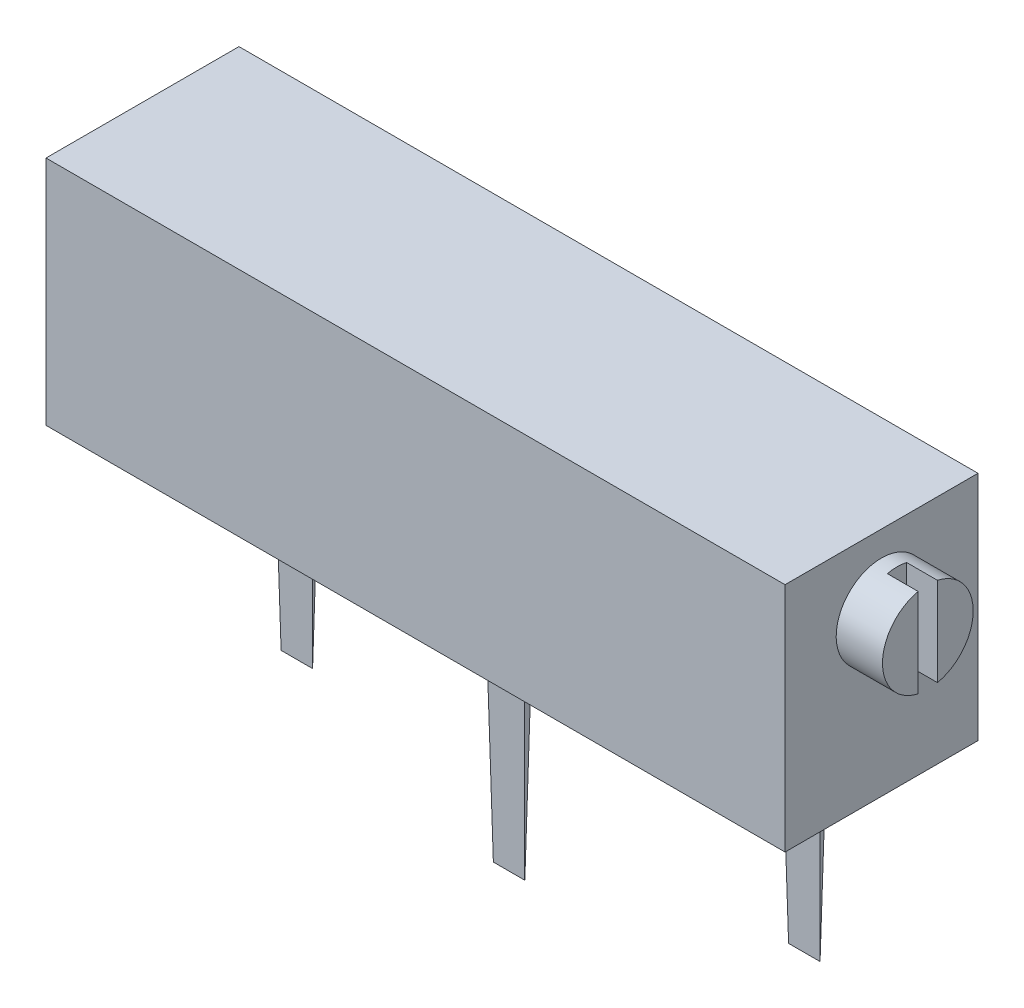
ISO-10303-21;
HEADER;
FILE_DESCRIPTION(('STEP AP214'),'2;1');
FILE_NAME('part.step','',(''),(''),'','','');
FILE_SCHEMA(('AUTOMOTIVE_DESIGN { 1 0 10303 214 1 1 1 1 }'));
ENDSEC;
DATA;
#1=APPLICATION_CONTEXT('core data for automotive mechanical design processes');
#2=APPLICATION_PROTOCOL_DEFINITION('international standard','automotive_design',2000,#1);
#3=PRODUCT_CONTEXT('',#1,'mechanical');
#4=PRODUCT('Part','Part','',(#3));
#5=PRODUCT_RELATED_PRODUCT_CATEGORY('part','',(#4));
#6=PRODUCT_DEFINITION_FORMATION('','',#4);
#7=PRODUCT_DEFINITION_CONTEXT('part definition',#1,'design');
#8=PRODUCT_DEFINITION('design','',#6,#7);
#9=PRODUCT_DEFINITION_SHAPE('','',#8);
#10=(LENGTH_UNIT() NAMED_UNIT(*) SI_UNIT(.MILLI.,.METRE.));
#11=(NAMED_UNIT(*) PLANE_ANGLE_UNIT() SI_UNIT($,.RADIAN.));
#12=(NAMED_UNIT(*) SI_UNIT($,.STERADIAN.) SOLID_ANGLE_UNIT());
#13=UNCERTAINTY_MEASURE_WITH_UNIT(LENGTH_MEASURE(1.E-05),#10,'distance_accuracy_value','');
#14=(GEOMETRIC_REPRESENTATION_CONTEXT(3) GLOBAL_UNCERTAINTY_ASSIGNED_CONTEXT((#13)) GLOBAL_UNIT_ASSIGNED_CONTEXT((#10,
#11,#12)) REPRESENTATION_CONTEXT('',''));
#15=CARTESIAN_POINT('',(0.,0.,0.));
#16=DIRECTION('',(0.,0.,1.));
#17=DIRECTION('',(1.,0.,0.));
#18=AXIS2_PLACEMENT_3D('',#15,#16,#17);
#19=CARTESIAN_POINT('',(15.65,0.,-3.6));
#20=DIRECTION('',(-0.999847695156391,-0.0174524064372835,0.));
#21=DIRECTION('',(0.0174524064372835,-0.999847695156391,0.));
#22=AXIS2_PLACEMENT_3D('',#19,#20,#21);
#23=PLANE('',#22);
#24=DIRECTION('',(0.,0.,-1.));
#25=VECTOR('',#24,1.);
#26=CARTESIAN_POINT('',(15.65,0.,-3.6));
#27=LINE('',#26,#25);
#28=CARTESIAN_POINT('',(15.65,0.,-3.4));
#29=VERTEX_POINT('',#28);
#30=CARTESIAN_POINT('',(15.65,0.,-3.6));
#31=VERTEX_POINT('',#30);
#32=EDGE_CURVE('E98',#29,#31,#27,.T.);
#33=ORIENTED_EDGE('',*,*,#32,.T.);
#34=DIRECTION('',(-0.0174497491606827,0.999695459881887,-0.0174497491606827));
#35=VECTOR('',#34,1.);
#36=CARTESIAN_POINT('',(15.65,0.,-3.6));
#37=LINE('',#36,#35);
#38=CARTESIAN_POINT('',(15.7460028571052,-5.5,-3.5039971428948));
#39=VERTEX_POINT('',#38);
#40=EDGE_CURVE('E12',#39,#31,#37,.T.);
#41=ORIENTED_EDGE('',*,*,#40,.F.);
#42=DIRECTION('',(0.,0.,1.));
#43=VECTOR('',#42,1.);
#44=CARTESIAN_POINT('',(15.7460028571052,-5.5,0.));
#45=LINE('',#44,#43);
#46=CARTESIAN_POINT('',(15.7460028571052,-5.5,-3.4960028571052));
#47=VERTEX_POINT('',#46);
#48=EDGE_CURVE('E114',#47,#39,#45,.F.);
#49=ORIENTED_EDGE('',*,*,#48,.F.);
#50=DIRECTION('',(-0.0174497491606827,0.999695459881887,0.0174497491606827));
#51=VECTOR('',#50,1.);
#52=CARTESIAN_POINT('',(15.6500608987492,-0.00348888700240246,-3.40006089874915));
#53=LINE('',#52,#51);
#54=EDGE_CURVE('E109',#47,#29,#53,.T.);
#55=ORIENTED_EDGE('',*,*,#54,.T.);
#56=EDGE_LOOP('',(#33,#41,#49,#55));
#57=FACE_BOUND('',#56,.T.);
#58=ADVANCED_FACE('F52',(#57),#23,.T.);
#59=CARTESIAN_POINT('',(15.65,0.,-3.6));
#60=DIRECTION('',(0.,-0.0174524064372835,-0.999847695156391));
#61=DIRECTION('',(0.,0.999847695156391,-0.0174524064372835));
#62=AXIS2_PLACEMENT_3D('',#59,#60,#61);
#63=PLANE('',#62);
#64=DIRECTION('',(1.,0.,0.));
#65=VECTOR('',#64,1.);
#66=CARTESIAN_POINT('',(15.65,0.,-3.6));
#67=LINE('',#66,#65);
#68=CARTESIAN_POINT('',(16.65,0.,-3.6));
#69=VERTEX_POINT('',#68);
#70=EDGE_CURVE('E94',#31,#69,#67,.T.);
#71=ORIENTED_EDGE('',*,*,#70,.T.);
#72=DIRECTION('',(0.0174497491606827,0.999695459881887,-0.0174497491606827));
#73=VECTOR('',#72,1.);
#74=CARTESIAN_POINT('',(16.65,0.,-3.6));
#75=LINE('',#74,#73);
#76=CARTESIAN_POINT('',(16.5539971428948,-5.5,-3.5039971428948));
#77=VERTEX_POINT('',#76);
#78=EDGE_CURVE('E61',#77,#69,#75,.T.);
#79=ORIENTED_EDGE('',*,*,#78,.F.);
#80=DIRECTION('',(-1.,0.,0.));
#81=VECTOR('',#80,1.);
#82=CARTESIAN_POINT('',(0.,-5.5,-3.5039971428948));
#83=LINE('',#82,#81);
#84=EDGE_CURVE('E105',#39,#77,#83,.F.);
#85=ORIENTED_EDGE('',*,*,#84,.F.);
#86=ORIENTED_EDGE('',*,*,#40,.T.);
#87=EDGE_LOOP('',(#71,#79,#85,#86));
#88=FACE_BOUND('',#87,.T.);
#89=ADVANCED_FACE('F54',(#88),#63,.T.);
#90=CARTESIAN_POINT('',(16.65,0.,-3.6));
#91=DIRECTION('',(0.999847695156391,-0.0174524064372835,0.));
#92=DIRECTION('',(0.0174524064372835,0.999847695156391,0.));
#93=AXIS2_PLACEMENT_3D('',#90,#91,#92);
#94=PLANE('',#93);
#95=DIRECTION('',(0.,0.,1.));
#96=VECTOR('',#95,1.);
#97=CARTESIAN_POINT('',(16.65,0.,-3.6));
#98=LINE('',#97,#96);
#99=CARTESIAN_POINT('',(16.65,0.,-3.4));
#100=VERTEX_POINT('',#99);
#101=EDGE_CURVE('E99',#69,#100,#98,.T.);
#102=ORIENTED_EDGE('',*,*,#101,.T.);
#103=DIRECTION('',(0.0174497491606827,0.999695459881887,0.0174497491606827));
#104=VECTOR('',#103,1.);
#105=CARTESIAN_POINT('',(16.6496955062542,-0.0174444350120123,-3.40030449374577));
#106=LINE('',#105,#104);
#107=CARTESIAN_POINT('',(16.5539971428948,-5.5,-3.4960028571052));
#108=VERTEX_POINT('',#107);
#109=EDGE_CURVE('E117',#108,#100,#106,.T.);
#110=ORIENTED_EDGE('',*,*,#109,.F.);
#111=DIRECTION('',(0.,0.,-1.));
#112=VECTOR('',#111,1.);
#113=CARTESIAN_POINT('',(16.5539971428948,-5.5,0.));
#114=LINE('',#113,#112);
#115=EDGE_CURVE('E73',#77,#108,#114,.F.);
#116=ORIENTED_EDGE('',*,*,#115,.F.);
#117=ORIENTED_EDGE('',*,*,#78,.T.);
#118=EDGE_LOOP('',(#102,#110,#116,#117));
#119=FACE_BOUND('',#118,.T.);
#120=ADVANCED_FACE('F124',(#119),#94,.T.);
#121=CARTESIAN_POINT('',(15.65,0.,-3.4));
#122=DIRECTION('',(0.,-0.0174524064372835,0.999847695156391));
#123=DIRECTION('',(0.,-0.999847695156391,-0.0174524064372835));
#124=AXIS2_PLACEMENT_3D('',#121,#122,#123);
#125=PLANE('',#124);
#126=DIRECTION('',(-1.,0.,0.));
#127=VECTOR('',#126,1.);
#128=CARTESIAN_POINT('',(15.65,0.,-3.4));
#129=LINE('',#128,#127);
#130=EDGE_CURVE('E113',#100,#29,#129,.T.);
#131=ORIENTED_EDGE('',*,*,#130,.T.);
#132=ORIENTED_EDGE('',*,*,#54,.F.);
#133=DIRECTION('',(1.,0.,0.));
#134=VECTOR('',#133,1.);
#135=CARTESIAN_POINT('',(0.,-5.5,-3.4960028571052));
#136=LINE('',#135,#134);
#137=EDGE_CURVE('E56',#108,#47,#136,.F.);
#138=ORIENTED_EDGE('',*,*,#137,.F.);
#139=ORIENTED_EDGE('',*,*,#109,.T.);
#140=EDGE_LOOP('',(#131,#132,#138,#139));
#141=FACE_BOUND('',#140,.T.);
#142=ADVANCED_FACE('F126',(#141),#125,.T.);
#143=CARTESIAN_POINT('',(0.,-5.5,0.));
#144=DIRECTION('',(0.,1.,0.));
#145=DIRECTION('',(0.,0.,1.));
#146=AXIS2_PLACEMENT_3D('',#143,#144,#145);
#147=PLANE('',#146);
#148=ORIENTED_EDGE('',*,*,#48,.T.);
#149=ORIENTED_EDGE('',*,*,#84,.T.);
#150=ORIENTED_EDGE('',*,*,#115,.T.);
#151=ORIENTED_EDGE('',*,*,#137,.T.);
#152=EDGE_LOOP('',(#148,#149,#150,#151));
#153=FACE_BOUND('',#152,.T.);
#154=ADVANCED_FACE('F122',(#153),#147,.F.);
#155=CARTESIAN_POINT('',(0.,0.,0.));
#156=DIRECTION('',(0.,1.,0.));
#157=DIRECTION('',(0.,0.,1.));
#158=AXIS2_PLACEMENT_3D('',#155,#156,#157);
#159=PLANE('',#158);
#160=ORIENTED_EDGE('',*,*,#32,.F.);
#161=ORIENTED_EDGE('',*,*,#130,.F.);
#162=ORIENTED_EDGE('',*,*,#101,.F.);
#163=ORIENTED_EDGE('',*,*,#70,.F.);
#164=EDGE_LOOP('',(#160,#161,#162,#163));
#165=FACE_BOUND('',#164,.T.);
#166=ADVANCED_FACE('F95',(#165),#159,.T.);
#167=CLOSED_SHELL('',(#58,#89,#120,#142,#154,#166));
#168=MANIFOLD_SOLID_BREP('B2',#167);
#169=CARTESIAN_POINT('',(10.,0.,-1.6));
#170=DIRECTION('',(-0.999847695156391,-0.0174524064372835,0.));
#171=DIRECTION('',(0.0174524064372835,-0.999847695156391,0.));
#172=AXIS2_PLACEMENT_3D('',#169,#170,#171);
#173=PLANE('',#172);
#174=DIRECTION('',(0.,0.,-1.));
#175=VECTOR('',#174,1.);
#176=CARTESIAN_POINT('',(10.,0.,-1.6));
#177=LINE('',#176,#175);
#178=CARTESIAN_POINT('',(10.,0.,-1.4));
#179=VERTEX_POINT('',#178);
#180=CARTESIAN_POINT('',(10.,0.,-1.6));
#181=VERTEX_POINT('',#180);
#182=EDGE_CURVE('E232',#179,#181,#177,.T.);
#183=ORIENTED_EDGE('',*,*,#182,.T.);
#184=DIRECTION('',(-0.0174497491606827,0.999695459881887,-0.0174497491606827));
#185=VECTOR('',#184,1.);
#186=CARTESIAN_POINT('',(10.,0.,-1.6));
#187=LINE('',#186,#185);
#188=CARTESIAN_POINT('',(10.0960028571052,-5.5,-1.5039971428948));
#189=VERTEX_POINT('',#188);
#190=EDGE_CURVE('E50',#189,#181,#187,.T.);
#191=ORIENTED_EDGE('',*,*,#190,.F.);
#192=DIRECTION('',(0.,0.,1.));
#193=VECTOR('',#192,1.);
#194=CARTESIAN_POINT('',(10.0960028571052,-5.5,0.));
#195=LINE('',#194,#193);
#196=CARTESIAN_POINT('',(10.0960028571052,-5.5,-1.4960028571052));
#197=VERTEX_POINT('',#196);
#198=EDGE_CURVE('E248',#197,#189,#195,.F.);
#199=ORIENTED_EDGE('',*,*,#198,.F.);
#200=DIRECTION('',(-0.0174497491606827,0.999695459881887,0.0174497491606827));
#201=VECTOR('',#200,1.);
#202=CARTESIAN_POINT('',(10.0000608987492,-0.00348888700240246,-1.40006089874915));
#203=LINE('',#202,#201);
#204=EDGE_CURVE('E243',#197,#179,#203,.T.);
#205=ORIENTED_EDGE('',*,*,#204,.T.);
#206=EDGE_LOOP('',(#183,#191,#199,#205));
#207=FACE_BOUND('',#206,.T.);
#208=ADVANCED_FACE('F186',(#207),#173,.T.);
#209=CARTESIAN_POINT('',(10.,0.,-1.6));
#210=DIRECTION('',(0.,-0.0174524064372835,-0.999847695156391));
#211=DIRECTION('',(0.,0.999847695156391,-0.0174524064372835));
#212=AXIS2_PLACEMENT_3D('',#209,#210,#211);
#213=PLANE('',#212);
#214=DIRECTION('',(1.,0.,0.));
#215=VECTOR('',#214,1.);
#216=CARTESIAN_POINT('',(10.,0.,-1.6));
#217=LINE('',#216,#215);
#218=CARTESIAN_POINT('',(11.,0.,-1.6));
#219=VERTEX_POINT('',#218);
#220=EDGE_CURVE('E228',#181,#219,#217,.T.);
#221=ORIENTED_EDGE('',*,*,#220,.T.);
#222=DIRECTION('',(0.0174497491606827,0.999695459881887,-0.0174497491606827));
#223=VECTOR('',#222,1.);
#224=CARTESIAN_POINT('',(11.,0.,-1.6));
#225=LINE('',#224,#223);
#226=CARTESIAN_POINT('',(10.9039971428948,-5.5,-1.5039971428948));
#227=VERTEX_POINT('',#226);
#228=EDGE_CURVE('E195',#227,#219,#225,.T.);
#229=ORIENTED_EDGE('',*,*,#228,.F.);
#230=DIRECTION('',(-1.,0.,0.));
#231=VECTOR('',#230,1.);
#232=CARTESIAN_POINT('',(0.,-5.5,-1.5039971428948));
#233=LINE('',#232,#231);
#234=EDGE_CURVE('E239',#189,#227,#233,.F.);
#235=ORIENTED_EDGE('',*,*,#234,.F.);
#236=ORIENTED_EDGE('',*,*,#190,.T.);
#237=EDGE_LOOP('',(#221,#229,#235,#236));
#238=FACE_BOUND('',#237,.T.);
#239=ADVANCED_FACE('F188',(#238),#213,.T.);
#240=CARTESIAN_POINT('',(11.,0.,-1.6));
#241=DIRECTION('',(0.999847695156391,-0.0174524064372835,0.));
#242=DIRECTION('',(0.0174524064372835,0.999847695156391,0.));
#243=AXIS2_PLACEMENT_3D('',#240,#241,#242);
#244=PLANE('',#243);
#245=DIRECTION('',(0.,0.,1.));
#246=VECTOR('',#245,1.);
#247=CARTESIAN_POINT('',(11.,0.,-1.6));
#248=LINE('',#247,#246);
#249=CARTESIAN_POINT('',(11.,0.,-1.4));
#250=VERTEX_POINT('',#249);
#251=EDGE_CURVE('E233',#219,#250,#248,.T.);
#252=ORIENTED_EDGE('',*,*,#251,.T.);
#253=DIRECTION('',(0.0174497491606827,0.999695459881887,0.0174497491606827));
#254=VECTOR('',#253,1.);
#255=CARTESIAN_POINT('',(10.9996955062542,-0.0174444350120123,-1.40030449374577));
#256=LINE('',#255,#254);
#257=CARTESIAN_POINT('',(10.9039971428948,-5.5,-1.4960028571052));
#258=VERTEX_POINT('',#257);
#259=EDGE_CURVE('E251',#258,#250,#256,.T.);
#260=ORIENTED_EDGE('',*,*,#259,.F.);
#261=DIRECTION('',(0.,0.,-1.));
#262=VECTOR('',#261,1.);
#263=CARTESIAN_POINT('',(10.9039971428948,-5.5,0.));
#264=LINE('',#263,#262);
#265=EDGE_CURVE('E207',#227,#258,#264,.F.);
#266=ORIENTED_EDGE('',*,*,#265,.F.);
#267=ORIENTED_EDGE('',*,*,#228,.T.);
#268=EDGE_LOOP('',(#252,#260,#266,#267));
#269=FACE_BOUND('',#268,.T.);
#270=ADVANCED_FACE('F258',(#269),#244,.T.);
#271=CARTESIAN_POINT('',(10.,0.,-1.4));
#272=DIRECTION('',(0.,-0.0174524064372835,0.999847695156391));
#273=DIRECTION('',(0.,-0.999847695156391,-0.0174524064372835));
#274=AXIS2_PLACEMENT_3D('',#271,#272,#273);
#275=PLANE('',#274);
#276=DIRECTION('',(-1.,0.,0.));
#277=VECTOR('',#276,1.);
#278=CARTESIAN_POINT('',(10.,0.,-1.4));
#279=LINE('',#278,#277);
#280=EDGE_CURVE('E247',#250,#179,#279,.T.);
#281=ORIENTED_EDGE('',*,*,#280,.T.);
#282=ORIENTED_EDGE('',*,*,#204,.F.);
#283=DIRECTION('',(1.,0.,0.));
#284=VECTOR('',#283,1.);
#285=CARTESIAN_POINT('',(0.,-5.5,-1.4960028571052));
#286=LINE('',#285,#284);
#287=EDGE_CURVE('E190',#258,#197,#286,.F.);
#288=ORIENTED_EDGE('',*,*,#287,.F.);
#289=ORIENTED_EDGE('',*,*,#259,.T.);
#290=EDGE_LOOP('',(#281,#282,#288,#289));
#291=FACE_BOUND('',#290,.T.);
#292=ADVANCED_FACE('F260',(#291),#275,.T.);
#293=CARTESIAN_POINT('',(0.,-5.5,0.));
#294=DIRECTION('',(0.,1.,0.));
#295=DIRECTION('',(0.,0.,1.));
#296=AXIS2_PLACEMENT_3D('',#293,#294,#295);
#297=PLANE('',#296);
#298=ORIENTED_EDGE('',*,*,#198,.T.);
#299=ORIENTED_EDGE('',*,*,#234,.T.);
#300=ORIENTED_EDGE('',*,*,#265,.T.);
#301=ORIENTED_EDGE('',*,*,#287,.T.);
#302=EDGE_LOOP('',(#298,#299,#300,#301));
#303=FACE_BOUND('',#302,.T.);
#304=ADVANCED_FACE('F256',(#303),#297,.F.);
#305=CARTESIAN_POINT('',(0.,0.,0.));
#306=DIRECTION('',(0.,1.,0.));
#307=DIRECTION('',(0.,0.,1.));
#308=AXIS2_PLACEMENT_3D('',#305,#306,#307);
#309=PLANE('',#308);
#310=ORIENTED_EDGE('',*,*,#182,.F.);
#311=ORIENTED_EDGE('',*,*,#280,.F.);
#312=ORIENTED_EDGE('',*,*,#251,.F.);
#313=ORIENTED_EDGE('',*,*,#220,.F.);
#314=EDGE_LOOP('',(#310,#311,#312,#313));
#315=FACE_BOUND('',#314,.T.);
#316=ADVANCED_FACE('F229',(#315),#309,.T.);
#317=CLOSED_SHELL('',(#208,#239,#270,#292,#304,#316));
#318=MANIFOLD_SOLID_BREP('B6',#317);
#319=CARTESIAN_POINT('',(2.5,0.,-3.6));
#320=DIRECTION('',(-0.999847695156391,-0.0174524064372835,0.));
#321=DIRECTION('',(0.0174524064372835,-0.999847695156391,0.));
#322=AXIS2_PLACEMENT_3D('',#319,#320,#321);
#323=PLANE('',#322);
#324=DIRECTION('',(0.,0.,-1.));
#325=VECTOR('',#324,1.);
#326=CARTESIAN_POINT('',(2.5,0.,-3.6));
#327=LINE('',#326,#325);
#328=CARTESIAN_POINT('',(2.5,0.,-3.4));
#329=VERTEX_POINT('',#328);
#330=CARTESIAN_POINT('',(2.5,0.,-3.6));
#331=VERTEX_POINT('',#330);
#332=EDGE_CURVE('E366',#329,#331,#327,.T.);
#333=ORIENTED_EDGE('',*,*,#332,.T.);
#334=DIRECTION('',(-0.0174497491606827,0.999695459881887,-0.0174497491606827));
#335=VECTOR('',#334,1.);
#336=CARTESIAN_POINT('',(2.5,0.,-3.6));
#337=LINE('',#336,#335);
#338=CARTESIAN_POINT('',(2.5960028571052,-5.5,-3.5039971428948));
#339=VERTEX_POINT('',#338);
#340=EDGE_CURVE('E184',#339,#331,#337,.T.);
#341=ORIENTED_EDGE('',*,*,#340,.F.);
#342=DIRECTION('',(0.,0.,1.));
#343=VECTOR('',#342,1.);
#344=CARTESIAN_POINT('',(2.5960028571052,-5.5,0.));
#345=LINE('',#344,#343);
#346=CARTESIAN_POINT('',(2.5960028571052,-5.5,-3.4960028571052));
#347=VERTEX_POINT('',#346);
#348=EDGE_CURVE('E382',#347,#339,#345,.F.);
#349=ORIENTED_EDGE('',*,*,#348,.F.);
#350=DIRECTION('',(-0.0174497491606827,0.999695459881887,0.0174497491606827));
#351=VECTOR('',#350,1.);
#352=CARTESIAN_POINT('',(2.50006089874915,-0.00348888700240246,-3.40006089874915));
#353=LINE('',#352,#351);
#354=EDGE_CURVE('E377',#347,#329,#353,.T.);
#355=ORIENTED_EDGE('',*,*,#354,.T.);
#356=EDGE_LOOP('',(#333,#341,#349,#355));
#357=FACE_BOUND('',#356,.T.);
#358=ADVANCED_FACE('F320',(#357),#323,.T.);
#359=CARTESIAN_POINT('',(2.5,0.,-3.6));
#360=DIRECTION('',(0.,-0.0174524064372835,-0.999847695156391));
#361=DIRECTION('',(0.,0.999847695156391,-0.0174524064372835));
#362=AXIS2_PLACEMENT_3D('',#359,#360,#361);
#363=PLANE('',#362);
#364=DIRECTION('',(1.,0.,0.));
#365=VECTOR('',#364,1.);
#366=CARTESIAN_POINT('',(2.5,0.,-3.6));
#367=LINE('',#366,#365);
#368=CARTESIAN_POINT('',(3.5,0.,-3.6));
#369=VERTEX_POINT('',#368);
#370=EDGE_CURVE('E362',#331,#369,#367,.T.);
#371=ORIENTED_EDGE('',*,*,#370,.T.);
#372=DIRECTION('',(0.0174497491606827,0.999695459881887,-0.0174497491606827));
#373=VECTOR('',#372,1.);
#374=CARTESIAN_POINT('',(3.5,0.,-3.6));
#375=LINE('',#374,#373);
#376=CARTESIAN_POINT('',(3.4039971428948,-5.5,-3.5039971428948));
#377=VERTEX_POINT('',#376);
#378=EDGE_CURVE('E329',#377,#369,#375,.T.);
#379=ORIENTED_EDGE('',*,*,#378,.F.);
#380=DIRECTION('',(-1.,0.,0.));
#381=VECTOR('',#380,1.);
#382=CARTESIAN_POINT('',(0.,-5.5,-3.5039971428948));
#383=LINE('',#382,#381);
#384=EDGE_CURVE('E373',#339,#377,#383,.F.);
#385=ORIENTED_EDGE('',*,*,#384,.F.);
#386=ORIENTED_EDGE('',*,*,#340,.T.);
#387=EDGE_LOOP('',(#371,#379,#385,#386));
#388=FACE_BOUND('',#387,.T.);
#389=ADVANCED_FACE('F322',(#388),#363,.T.);
#390=CARTESIAN_POINT('',(3.5,0.,-3.6));
#391=DIRECTION('',(0.999847695156391,-0.0174524064372835,0.));
#392=DIRECTION('',(0.0174524064372835,0.999847695156391,0.));
#393=AXIS2_PLACEMENT_3D('',#390,#391,#392);
#394=PLANE('',#393);
#395=DIRECTION('',(0.,0.,1.));
#396=VECTOR('',#395,1.);
#397=CARTESIAN_POINT('',(3.5,0.,-3.6));
#398=LINE('',#397,#396);
#399=CARTESIAN_POINT('',(3.5,0.,-3.4));
#400=VERTEX_POINT('',#399);
#401=EDGE_CURVE('E367',#369,#400,#398,.T.);
#402=ORIENTED_EDGE('',*,*,#401,.T.);
#403=DIRECTION('',(0.0174497491606827,0.999695459881887,0.0174497491606827));
#404=VECTOR('',#403,1.);
#405=CARTESIAN_POINT('',(3.49969550625423,-0.0174444350120123,-3.40030449374577));
#406=LINE('',#405,#404);
#407=CARTESIAN_POINT('',(3.4039971428948,-5.5,-3.4960028571052));
#408=VERTEX_POINT('',#407);
#409=EDGE_CURVE('E385',#408,#400,#406,.T.);
#410=ORIENTED_EDGE('',*,*,#409,.F.);
#411=DIRECTION('',(0.,0.,-1.));
#412=VECTOR('',#411,1.);
#413=CARTESIAN_POINT('',(3.4039971428948,-5.5,0.));
#414=LINE('',#413,#412);
#415=EDGE_CURVE('E341',#377,#408,#414,.F.);
#416=ORIENTED_EDGE('',*,*,#415,.F.);
#417=ORIENTED_EDGE('',*,*,#378,.T.);
#418=EDGE_LOOP('',(#402,#410,#416,#417));
#419=FACE_BOUND('',#418,.T.);
#420=ADVANCED_FACE('F392',(#419),#394,.T.);
#421=CARTESIAN_POINT('',(2.5,0.,-3.4));
#422=DIRECTION('',(0.,-0.0174524064372835,0.999847695156391));
#423=DIRECTION('',(0.,-0.999847695156391,-0.0174524064372835));
#424=AXIS2_PLACEMENT_3D('',#421,#422,#423);
#425=PLANE('',#424);
#426=DIRECTION('',(-1.,0.,0.));
#427=VECTOR('',#426,1.);
#428=CARTESIAN_POINT('',(2.5,0.,-3.4));
#429=LINE('',#428,#427);
#430=EDGE_CURVE('E381',#400,#329,#429,.T.);
#431=ORIENTED_EDGE('',*,*,#430,.T.);
#432=ORIENTED_EDGE('',*,*,#354,.F.);
#433=DIRECTION('',(1.,0.,0.));
#434=VECTOR('',#433,1.);
#435=CARTESIAN_POINT('',(0.,-5.5,-3.4960028571052));
#436=LINE('',#435,#434);
#437=EDGE_CURVE('E324',#408,#347,#436,.F.);
#438=ORIENTED_EDGE('',*,*,#437,.F.);
#439=ORIENTED_EDGE('',*,*,#409,.T.);
#440=EDGE_LOOP('',(#431,#432,#438,#439));
#441=FACE_BOUND('',#440,.T.);
#442=ADVANCED_FACE('F394',(#441),#425,.T.);
#443=CARTESIAN_POINT('',(0.,-5.5,0.));
#444=DIRECTION('',(0.,1.,0.));
#445=DIRECTION('',(0.,0.,1.));
#446=AXIS2_PLACEMENT_3D('',#443,#444,#445);
#447=PLANE('',#446);
#448=ORIENTED_EDGE('',*,*,#348,.T.);
#449=ORIENTED_EDGE('',*,*,#384,.T.);
#450=ORIENTED_EDGE('',*,*,#415,.T.);
#451=ORIENTED_EDGE('',*,*,#437,.T.);
#452=EDGE_LOOP('',(#448,#449,#450,#451));
#453=FACE_BOUND('',#452,.T.);
#454=ADVANCED_FACE('F390',(#453),#447,.F.);
#455=CARTESIAN_POINT('',(0.,0.,0.));
#456=DIRECTION('',(0.,1.,0.));
#457=DIRECTION('',(0.,0.,1.));
#458=AXIS2_PLACEMENT_3D('',#455,#456,#457);
#459=PLANE('',#458);
#460=ORIENTED_EDGE('',*,*,#332,.F.);
#461=ORIENTED_EDGE('',*,*,#430,.F.);
#462=ORIENTED_EDGE('',*,*,#401,.F.);
#463=ORIENTED_EDGE('',*,*,#370,.F.);
#464=EDGE_LOOP('',(#460,#461,#462,#463));
#465=FACE_BOUND('',#464,.T.);
#466=ADVANCED_FACE('F363',(#465),#459,.T.);
#467=CLOSED_SHELL('',(#358,#389,#420,#442,#454,#466));
#468=MANIFOLD_SOLID_BREP('B44',#467);
#469=CARTESIAN_POINT('',(20.35,4.175,-2.5));
#470=DIRECTION('',(1.,0.,0.));
#471=DIRECTION('',(0.,0.,-1.));
#472=AXIS2_PLACEMENT_3D('',#469,#470,#471);
#473=PLANE('',#472);
#474=DIRECTION('',(0.,-1.,0.));
#475=VECTOR('',#474,1.);
#476=CARTESIAN_POINT('',(20.35,4.175,-2.25));
#477=LINE('',#476,#475);
#478=CARTESIAN_POINT('',(20.35,5.3230962503205,-2.25));
#479=VERTEX_POINT('',#478);
#480=CARTESIAN_POINT('',(20.35,3.0269037496795,-2.25));
#481=VERTEX_POINT('',#480);
#482=EDGE_CURVE('E499',#479,#481,#477,.T.);
#483=ORIENTED_EDGE('',*,*,#482,.F.);
#484=CARTESIAN_POINT('',(20.35,4.175,-2.5));
#485=DIRECTION('',(1.,0.,0.));
#486=DIRECTION('',(0.,0.,-1.));
#487=AXIS2_PLACEMENT_3D('',#484,#485,#486);
#488=CIRCLE('',#487,1.175);
#489=EDGE_CURVE('E500',#479,#481,#488,.T.);
#490=ORIENTED_EDGE('',*,*,#489,.T.);
#491=EDGE_LOOP('',(#483,#490));
#492=FACE_BOUND('',#491,.T.);
#493=ADVANCED_FACE('F453',(#492),#473,.T.);
#494=CARTESIAN_POINT('',(20.35,4.175,-2.5));
#495=DIRECTION('',(-1.,0.,0.));
#496=DIRECTION('',(0.,0.,1.));
#497=AXIS2_PLACEMENT_3D('',#494,#495,#496);
#498=CYLINDRICAL_SURFACE('',#497,1.175);
#499=ORIENTED_EDGE('',*,*,#489,.F.);
#500=DIRECTION('',(-1.,0.,0.));
#501=VECTOR('',#500,1.);
#502=CARTESIAN_POINT('',(20.35,5.3230962503205,-2.25));
#503=LINE('',#502,#501);
#504=CARTESIAN_POINT('',(19.55,5.3230962503205,-2.25));
#505=VERTEX_POINT('',#504);
#506=EDGE_CURVE('E513',#479,#505,#503,.T.);
#507=ORIENTED_EDGE('',*,*,#506,.T.);
#508=CARTESIAN_POINT('',(19.55,4.175,-2.5));
#509=DIRECTION('',(1.,0.,0.));
#510=DIRECTION('',(0.,0.,-1.));
#511=AXIS2_PLACEMENT_3D('',#508,#509,#510);
#512=CIRCLE('',#511,1.175);
#513=CARTESIAN_POINT('',(19.55,5.3230962503205,-2.75));
#514=VERTEX_POINT('',#513);
#515=EDGE_CURVE('E318',#514,#505,#512,.T.);
#516=ORIENTED_EDGE('',*,*,#515,.F.);
#517=DIRECTION('',(-1.,0.,0.));
#518=VECTOR('',#517,1.);
#519=CARTESIAN_POINT('',(20.35,5.3230962503205,-2.75));
#520=LINE('',#519,#518);
#521=CARTESIAN_POINT('',(20.35,5.3230962503205,-2.75));
#522=VERTEX_POINT('',#521);
#523=EDGE_CURVE('E494',#514,#522,#520,.F.);
#524=ORIENTED_EDGE('',*,*,#523,.T.);
#525=CARTESIAN_POINT('',(20.35,3.0269037496795,-2.75));
#526=VERTEX_POINT('',#525);
#527=EDGE_CURVE('E504',#526,#522,#488,.T.);
#528=ORIENTED_EDGE('',*,*,#527,.F.);
#529=DIRECTION('',(-1.,0.,0.));
#530=VECTOR('',#529,1.);
#531=CARTESIAN_POINT('',(20.35,3.0269037496795,-2.75));
#532=LINE('',#531,#530);
#533=CARTESIAN_POINT('',(19.55,3.0269037496795,-2.75));
#534=VERTEX_POINT('',#533);
#535=EDGE_CURVE('E468',#526,#534,#532,.T.);
#536=ORIENTED_EDGE('',*,*,#535,.T.);
#537=CARTESIAN_POINT('',(19.55,3.0269037496795,-2.25));
#538=VERTEX_POINT('',#537);
#539=EDGE_CURVE('E457',#538,#534,#512,.T.);
#540=ORIENTED_EDGE('',*,*,#539,.F.);
#541=DIRECTION('',(-1.,0.,0.));
#542=VECTOR('',#541,1.);
#543=CARTESIAN_POINT('',(20.35,3.0269037496795,-2.25));
#544=LINE('',#543,#542);
#545=EDGE_CURVE('E525',#538,#481,#544,.F.);
#546=ORIENTED_EDGE('',*,*,#545,.T.);
#547=EDGE_LOOP('',(#499,#507,#516,#524,#528,#536,#540,#546));
#548=FACE_BOUND('',#547,.T.);
#549=CARTESIAN_POINT('',(19.15,4.175,-2.5));
#550=DIRECTION('',(1.,0.,0.));
#551=DIRECTION('',(0.,0.,-1.));
#552=AXIS2_PLACEMENT_3D('',#549,#550,#551);
#553=CIRCLE('',#552,1.175);
#554=CARTESIAN_POINT('',(19.15,4.175,-3.675));
#555=VERTEX_POINT('',#554);
#556=EDGE_CURVE('E509',#555,#555,#553,.T.);
#557=ORIENTED_EDGE('',*,*,#556,.T.);
#558=EDGE_LOOP('',(#557));
#559=FACE_BOUND('',#558,.T.);
#560=ADVANCED_FACE('F455',(#548,#559),#498,.T.);
#561=DIRECTION('',(0.,1.,0.));
#562=VECTOR('',#561,1.);
#563=CARTESIAN_POINT('',(20.35,4.175,-2.75));
#564=LINE('',#563,#562);
#565=EDGE_CURVE('E491',#526,#522,#564,.T.);
#566=ORIENTED_EDGE('',*,*,#565,.F.);
#567=ORIENTED_EDGE('',*,*,#527,.T.);
#568=EDGE_LOOP('',(#566,#567));
#569=FACE_BOUND('',#568,.T.);
#570=ADVANCED_FACE('F508',(#569),#473,.T.);
#571=CARTESIAN_POINT('',(19.15,4.175,-2.5));
#572=DIRECTION('',(1.,0.,0.));
#573=DIRECTION('',(0.,0.,-1.));
#574=AXIS2_PLACEMENT_3D('',#571,#572,#573);
#575=PLANE('',#574);
#576=ORIENTED_EDGE('',*,*,#556,.F.);
#577=EDGE_LOOP('',(#576));
#578=FACE_BOUND('',#577,.T.);
#579=ADVANCED_FACE('F537',(#578),#575,.F.);
#580=CARTESIAN_POINT('',(19.55,0.,0.));
#581=DIRECTION('',(1.,0.,0.));
#582=DIRECTION('',(0.,0.,-1.));
#583=AXIS2_PLACEMENT_3D('',#580,#581,#582);
#584=PLANE('',#583);
#585=DIRECTION('',(0.,1.,0.));
#586=VECTOR('',#585,1.);
#587=CARTESIAN_POINT('',(19.55,5.35,-2.75));
#588=LINE('',#587,#586);
#589=EDGE_CURVE('E506',#534,#514,#588,.T.);
#590=ORIENTED_EDGE('',*,*,#589,.T.);
#591=ORIENTED_EDGE('',*,*,#515,.T.);
#592=DIRECTION('',(0.,-1.,0.));
#593=VECTOR('',#592,1.);
#594=CARTESIAN_POINT('',(19.55,5.35,-2.25));
#595=LINE('',#594,#593);
#596=EDGE_CURVE('E523',#505,#538,#595,.T.);
#597=ORIENTED_EDGE('',*,*,#596,.T.);
#598=ORIENTED_EDGE('',*,*,#539,.T.);
#599=EDGE_LOOP('',(#590,#591,#597,#598));
#600=FACE_BOUND('',#599,.T.);
#601=ADVANCED_FACE('F521',(#600),#584,.T.);
#602=CARTESIAN_POINT('',(19.55,5.35,-2.25));
#603=DIRECTION('',(0.,0.,1.));
#604=DIRECTION('',(0.,-1.,0.));
#605=AXIS2_PLACEMENT_3D('',#602,#603,#604);
#606=PLANE('',#605);
#607=ORIENTED_EDGE('',*,*,#482,.T.);
#608=ORIENTED_EDGE('',*,*,#545,.F.);
#609=ORIENTED_EDGE('',*,*,#596,.F.);
#610=ORIENTED_EDGE('',*,*,#506,.F.);
#611=EDGE_LOOP('',(#607,#608,#609,#610));
#612=FACE_BOUND('',#611,.T.);
#613=ADVANCED_FACE('F528',(#612),#606,.F.);
#614=CARTESIAN_POINT('',(19.55,5.35,-2.75));
#615=DIRECTION('',(0.,0.,-1.));
#616=DIRECTION('',(0.,1.,0.));
#617=AXIS2_PLACEMENT_3D('',#614,#615,#616);
#618=PLANE('',#617);
#619=ORIENTED_EDGE('',*,*,#565,.T.);
#620=ORIENTED_EDGE('',*,*,#523,.F.);
#621=ORIENTED_EDGE('',*,*,#589,.F.);
#622=ORIENTED_EDGE('',*,*,#535,.F.);
#623=EDGE_LOOP('',(#619,#620,#621,#622));
#624=FACE_BOUND('',#623,.T.);
#625=ADVANCED_FACE('F493',(#624),#618,.F.);
#626=CLOSED_SHELL('',(#493,#560,#570,#579,#601,#613,#625));
#627=MANIFOLD_SOLID_BREP('B178',#626);
#628=CARTESIAN_POINT('',(0.,6.,0.));
#629=DIRECTION('',(1.,0.,0.));
#630=DIRECTION('',(0.,0.,-1.));
#631=AXIS2_PLACEMENT_3D('',#628,#629,#630);
#632=PLANE('',#631);
#633=DIRECTION('',(0.,0.,1.));
#634=VECTOR('',#633,1.);
#635=CARTESIAN_POINT('',(0.,0.,0.));
#636=LINE('',#635,#634);
#637=CARTESIAN_POINT('',(0.,0.,-5.));
#638=VERTEX_POINT('',#637);
#639=CARTESIAN_POINT('',(0.,0.,0.));
#640=VERTEX_POINT('',#639);
#641=EDGE_CURVE('E657',#638,#640,#636,.T.);
#642=ORIENTED_EDGE('',*,*,#641,.T.);
#643=DIRECTION('',(0.,-1.,0.));
#644=VECTOR('',#643,1.);
#645=CARTESIAN_POINT('',(0.,6.,0.));
#646=LINE('',#645,#644);
#647=CARTESIAN_POINT('',(0.,6.,0.));
#648=VERTEX_POINT('',#647);
#649=EDGE_CURVE('E451',#648,#640,#646,.T.);
#650=ORIENTED_EDGE('',*,*,#649,.F.);
#651=DIRECTION('',(0.,0.,1.));
#652=VECTOR('',#651,1.);
#653=CARTESIAN_POINT('',(0.,6.,0.));
#654=LINE('',#653,#652);
#655=CARTESIAN_POINT('',(0.,6.,-5.));
#656=VERTEX_POINT('',#655);
#657=EDGE_CURVE('E641',#656,#648,#654,.T.);
#658=ORIENTED_EDGE('',*,*,#657,.F.);
#659=DIRECTION('',(0.,-1.,0.));
#660=VECTOR('',#659,1.);
#661=CARTESIAN_POINT('',(0.,6.,-5.));
#662=LINE('',#661,#660);
#663=EDGE_CURVE('E653',#656,#638,#662,.T.);
#664=ORIENTED_EDGE('',*,*,#663,.T.);
#665=EDGE_LOOP('',(#642,#650,#658,#664));
#666=FACE_BOUND('',#665,.T.);
#667=ADVANCED_FACE('F589',(#666),#632,.F.);
#668=CARTESIAN_POINT('',(0.,6.,0.));
#669=DIRECTION('',(0.,0.,-1.));
#670=DIRECTION('',(-1.,0.,0.));
#671=AXIS2_PLACEMENT_3D('',#668,#669,#670);
#672=PLANE('',#671);
#673=DIRECTION('',(1.,0.,0.));
#674=VECTOR('',#673,1.);
#675=CARTESIAN_POINT('',(0.,0.,0.));
#676=LINE('',#675,#674);
#677=CARTESIAN_POINT('',(19.15,0.,0.));
#678=VERTEX_POINT('',#677);
#679=EDGE_CURVE('E646',#640,#678,#676,.T.);
#680=ORIENTED_EDGE('',*,*,#679,.T.);
#681=DIRECTION('',(0.,-1.,0.));
#682=VECTOR('',#681,1.);
#683=CARTESIAN_POINT('',(19.15,6.,0.));
#684=LINE('',#683,#682);
#685=CARTESIAN_POINT('',(19.15,6.,0.));
#686=VERTEX_POINT('',#685);
#687=EDGE_CURVE('E598',#686,#678,#684,.T.);
#688=ORIENTED_EDGE('',*,*,#687,.F.);
#689=DIRECTION('',(1.,0.,0.));
#690=VECTOR('',#689,1.);
#691=CARTESIAN_POINT('',(0.,6.,0.));
#692=LINE('',#691,#690);
#693=EDGE_CURVE('E636',#648,#686,#692,.T.);
#694=ORIENTED_EDGE('',*,*,#693,.F.);
#695=ORIENTED_EDGE('',*,*,#649,.T.);
#696=EDGE_LOOP('',(#680,#688,#694,#695));
#697=FACE_BOUND('',#696,.T.);
#698=ADVANCED_FACE('F645',(#697),#672,.F.);
#699=CARTESIAN_POINT('',(19.15,6.,0.));
#700=DIRECTION('',(-1.,0.,0.));
#701=DIRECTION('',(0.,0.,1.));
#702=AXIS2_PLACEMENT_3D('',#699,#700,#701);
#703=PLANE('',#702);
#704=DIRECTION('',(0.,0.,-1.));
#705=VECTOR('',#704,1.);
#706=CARTESIAN_POINT('',(19.15,0.,0.));
#707=LINE('',#706,#705);
#708=CARTESIAN_POINT('',(19.15,0.,-5.));
#709=VERTEX_POINT('',#708);
#710=EDGE_CURVE('E623',#678,#709,#707,.T.);
#711=ORIENTED_EDGE('',*,*,#710,.T.);
#712=DIRECTION('',(0.,-1.,0.));
#713=VECTOR('',#712,1.);
#714=CARTESIAN_POINT('',(19.15,6.,-5.));
#715=LINE('',#714,#713);
#716=CARTESIAN_POINT('',(19.15,6.,-5.));
#717=VERTEX_POINT('',#716);
#718=EDGE_CURVE('E648',#717,#709,#715,.T.);
#719=ORIENTED_EDGE('',*,*,#718,.F.);
#720=DIRECTION('',(0.,0.,-1.));
#721=VECTOR('',#720,1.);
#722=CARTESIAN_POINT('',(19.15,6.,0.));
#723=LINE('',#722,#721);
#724=EDGE_CURVE('E639',#686,#717,#723,.T.);
#725=ORIENTED_EDGE('',*,*,#724,.F.);
#726=ORIENTED_EDGE('',*,*,#687,.T.);
#727=EDGE_LOOP('',(#711,#719,#725,#726));
#728=FACE_BOUND('',#727,.T.);
#729=ADVANCED_FACE('F649',(#728),#703,.F.);
#730=CARTESIAN_POINT('',(0.,6.,-5.));
#731=DIRECTION('',(0.,0.,1.));
#732=DIRECTION('',(1.,0.,0.));
#733=AXIS2_PLACEMENT_3D('',#730,#731,#732);
#734=PLANE('',#733);
#735=DIRECTION('',(-1.,0.,0.));
#736=VECTOR('',#735,1.);
#737=CARTESIAN_POINT('',(0.,0.,-5.));
#738=LINE('',#737,#736);
#739=EDGE_CURVE('E629',#709,#638,#738,.T.);
#740=ORIENTED_EDGE('',*,*,#739,.T.);
#741=ORIENTED_EDGE('',*,*,#663,.F.);
#742=DIRECTION('',(-1.,0.,0.));
#743=VECTOR('',#742,1.);
#744=CARTESIAN_POINT('',(0.,6.,-5.));
#745=LINE('',#744,#743);
#746=EDGE_CURVE('E606',#717,#656,#745,.T.);
#747=ORIENTED_EDGE('',*,*,#746,.F.);
#748=ORIENTED_EDGE('',*,*,#718,.T.);
#749=EDGE_LOOP('',(#740,#741,#747,#748));
#750=FACE_BOUND('',#749,.T.);
#751=ADVANCED_FACE('F670',(#750),#734,.F.);
#752=CARTESIAN_POINT('',(0.,6.,0.));
#753=DIRECTION('',(0.,-1.,0.));
#754=DIRECTION('',(0.,0.,-1.));
#755=AXIS2_PLACEMENT_3D('',#752,#753,#754);
#756=PLANE('',#755);
#757=ORIENTED_EDGE('',*,*,#657,.T.);
#758=ORIENTED_EDGE('',*,*,#693,.T.);
#759=ORIENTED_EDGE('',*,*,#724,.T.);
#760=ORIENTED_EDGE('',*,*,#746,.T.);
#761=EDGE_LOOP('',(#757,#758,#759,#760));
#762=FACE_BOUND('',#761,.T.);
#763=ADVANCED_FACE('F637',(#762),#756,.F.);
#764=CARTESIAN_POINT('',(0.,0.,0.));
#765=DIRECTION('',(0.,-1.,0.));
#766=DIRECTION('',(0.,0.,-1.));
#767=AXIS2_PLACEMENT_3D('',#764,#765,#766);
#768=PLANE('',#767);
#769=ORIENTED_EDGE('',*,*,#641,.F.);
#770=ORIENTED_EDGE('',*,*,#739,.F.);
#771=ORIENTED_EDGE('',*,*,#710,.F.);
#772=ORIENTED_EDGE('',*,*,#679,.F.);
#773=EDGE_LOOP('',(#769,#770,#771,#772));
#774=FACE_BOUND('',#773,.T.);
#775=ADVANCED_FACE('F673',(#774),#768,.T.);
#776=CLOSED_SHELL('',(#667,#698,#729,#751,#763,#775));
#777=MANIFOLD_SOLID_BREP('B312',#776);
#778=ADVANCED_BREP_SHAPE_REPRESENTATION('',(#18,#168,#318,#468,#627,#777),#14);
#779=SHAPE_DEFINITION_REPRESENTATION(#9,#778);
ENDSEC;
END-ISO-10303-21;
